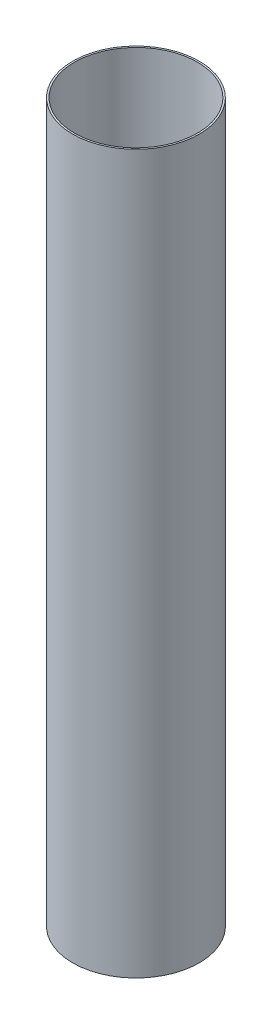
ISO-10303-21;
HEADER;
FILE_DESCRIPTION(('STEP AP214'),'2;1');
FILE_NAME('part.step','',(''),(''),'','','');
FILE_SCHEMA(('AUTOMOTIVE_DESIGN { 1 0 10303 214 1 1 1 1 }'));
ENDSEC;
DATA;
#1=APPLICATION_CONTEXT('core data for automotive mechanical design processes');
#2=APPLICATION_PROTOCOL_DEFINITION('international standard','automotive_design',2000,#1);
#3=PRODUCT_CONTEXT('',#1,'mechanical');
#4=PRODUCT('Part','Part','',(#3));
#5=PRODUCT_RELATED_PRODUCT_CATEGORY('part','',(#4));
#6=PRODUCT_DEFINITION_FORMATION('','',#4);
#7=PRODUCT_DEFINITION_CONTEXT('part definition',#1,'design');
#8=PRODUCT_DEFINITION('design','',#6,#7);
#9=PRODUCT_DEFINITION_SHAPE('','',#8);
#10=(LENGTH_UNIT() NAMED_UNIT(*) SI_UNIT(.MILLI.,.METRE.));
#11=(NAMED_UNIT(*) PLANE_ANGLE_UNIT() SI_UNIT($,.RADIAN.));
#12=(NAMED_UNIT(*) SI_UNIT($,.STERADIAN.) SOLID_ANGLE_UNIT());
#13=UNCERTAINTY_MEASURE_WITH_UNIT(LENGTH_MEASURE(1.E-05),#10,'distance_accuracy_value','');
#14=(GEOMETRIC_REPRESENTATION_CONTEXT(3) GLOBAL_UNCERTAINTY_ASSIGNED_CONTEXT((#13)) GLOBAL_UNIT_ASSIGNED_CONTEXT((#10,
#11,#12)) REPRESENTATION_CONTEXT('',''));
#15=CARTESIAN_POINT('',(0.,0.,0.));
#16=DIRECTION('',(0.,0.,1.));
#17=DIRECTION('',(1.,0.,0.));
#18=AXIS2_PLACEMENT_3D('',#15,#16,#17);
#19=CARTESIAN_POINT('',(0.,889.,0.));
#20=DIRECTION('',(0.,1.,0.));
#21=DIRECTION('',(0.,0.,1.));
#22=AXIS2_PLACEMENT_3D('',#19,#20,#21);
#23=PLANE('',#22);
#24=CARTESIAN_POINT('',(0.,889.,0.));
#25=DIRECTION('',(0.,1.,0.));
#26=DIRECTION('',(0.,0.,1.));
#27=AXIS2_PLACEMENT_3D('',#24,#25,#26);
#28=CIRCLE('',#27,78.359);
#29=CARTESIAN_POINT('',(0.,889.,78.359));
#30=VERTEX_POINT('',#29);
#31=EDGE_CURVE('E10',#30,#30,#28,.T.);
#32=ORIENTED_EDGE('',*,*,#31,.T.);
#33=EDGE_LOOP('',(#32));
#34=FACE_BOUND('',#33,.T.);
#35=CARTESIAN_POINT('',(0.,889.,0.));
#36=DIRECTION('',(0.,1.,0.));
#37=DIRECTION('',(0.,0.,1.));
#38=AXIS2_PLACEMENT_3D('',#35,#36,#37);
#39=CIRCLE('',#38,76.2);
#40=CARTESIAN_POINT('',(0.,889.,76.2));
#41=VERTEX_POINT('',#40);
#42=EDGE_CURVE('E42',#41,#41,#39,.T.);
#43=ORIENTED_EDGE('',*,*,#42,.F.);
#44=EDGE_LOOP('',(#43));
#45=FACE_BOUND('',#44,.T.);
#46=ADVANCED_FACE('F31',(#34,#45),#23,.T.);
#47=CARTESIAN_POINT('',(0.,0.,0.));
#48=DIRECTION('',(0.,1.,0.));
#49=DIRECTION('',(0.,0.,1.));
#50=AXIS2_PLACEMENT_3D('',#47,#48,#49);
#51=PLANE('',#50);
#52=CARTESIAN_POINT('',(0.,0.,0.));
#53=DIRECTION('',(0.,1.,0.));
#54=DIRECTION('',(0.,0.,1.));
#55=AXIS2_PLACEMENT_3D('',#52,#53,#54);
#56=CIRCLE('',#55,78.359);
#57=CARTESIAN_POINT('',(0.,0.,78.359));
#58=VERTEX_POINT('',#57);
#59=EDGE_CURVE('E35',#58,#58,#56,.T.);
#60=ORIENTED_EDGE('',*,*,#59,.F.);
#61=EDGE_LOOP('',(#60));
#62=FACE_BOUND('',#61,.T.);
#63=CARTESIAN_POINT('',(0.,0.,0.));
#64=DIRECTION('',(0.,1.,0.));
#65=DIRECTION('',(0.,0.,1.));
#66=AXIS2_PLACEMENT_3D('',#63,#64,#65);
#67=CIRCLE('',#66,76.2);
#68=CARTESIAN_POINT('',(0.,0.,76.2));
#69=VERTEX_POINT('',#68);
#70=EDGE_CURVE('E44',#69,#69,#67,.T.);
#71=ORIENTED_EDGE('',*,*,#70,.T.);
#72=EDGE_LOOP('',(#71));
#73=FACE_BOUND('',#72,.T.);
#74=ADVANCED_FACE('F54',(#62,#73),#51,.F.);
#75=CARTESIAN_POINT('',(0.,889.,0.));
#76=DIRECTION('',(0.,-1.,0.));
#77=DIRECTION('',(0.,0.,-1.));
#78=AXIS2_PLACEMENT_3D('',#75,#76,#77);
#79=CYLINDRICAL_SURFACE('',#78,78.359);
#80=ORIENTED_EDGE('',*,*,#31,.F.);
#81=EDGE_LOOP('',(#80));
#82=FACE_BOUND('',#81,.T.);
#83=ORIENTED_EDGE('',*,*,#59,.T.);
#84=EDGE_LOOP('',(#83));
#85=FACE_BOUND('',#84,.T.);
#86=ADVANCED_FACE('F33',(#82,#85),#79,.T.);
#87=CARTESIAN_POINT('',(0.,889.,0.));
#88=DIRECTION('',(0.,-1.,0.));
#89=DIRECTION('',(0.,0.,-1.));
#90=AXIS2_PLACEMENT_3D('',#87,#88,#89);
#91=CYLINDRICAL_SURFACE('',#90,76.2);
#92=ORIENTED_EDGE('',*,*,#42,.T.);
#93=EDGE_LOOP('',(#92));
#94=FACE_BOUND('',#93,.T.);
#95=ORIENTED_EDGE('',*,*,#70,.F.);
#96=EDGE_LOOP('',(#95));
#97=FACE_BOUND('',#96,.T.);
#98=ADVANCED_FACE('F50',(#94,#97),#91,.F.);
#99=CLOSED_SHELL('',(#46,#74,#86,#98));
#100=MANIFOLD_SOLID_BREP('B2',#99);
#101=ADVANCED_BREP_SHAPE_REPRESENTATION('',(#18,#100),#14);
#102=SHAPE_DEFINITION_REPRESENTATION(#9,#101);
ENDSEC;
END-ISO-10303-21;
